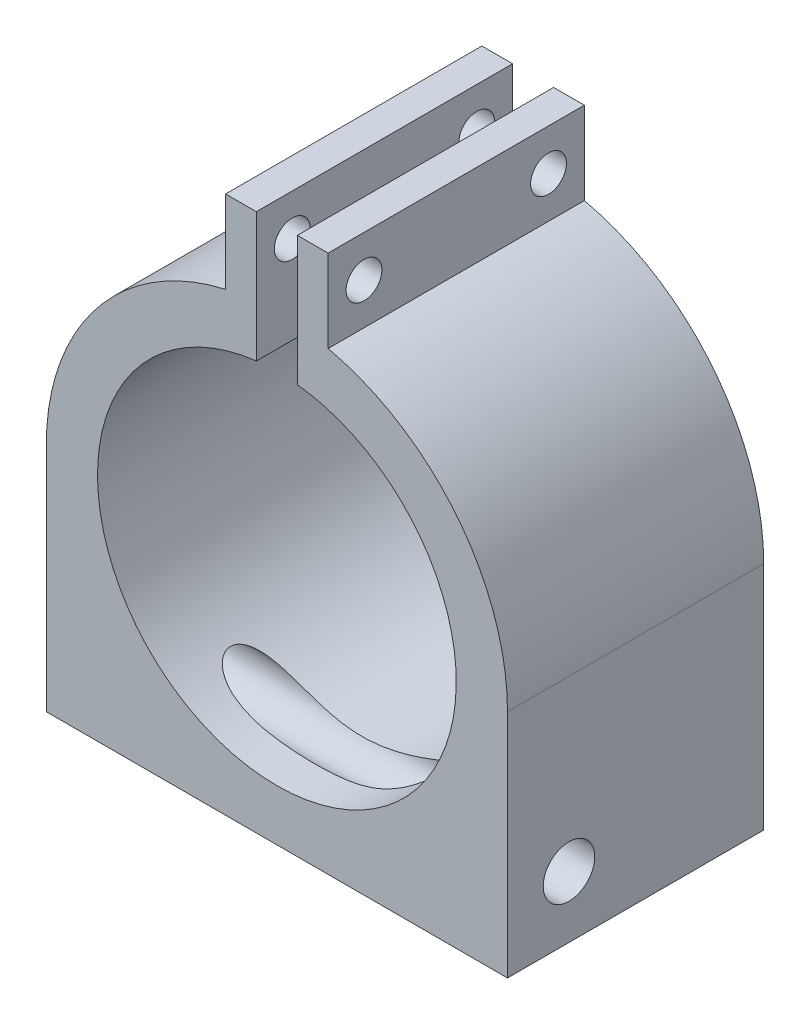
ISO-10303-21;
HEADER;
FILE_DESCRIPTION(('STEP AP214'),'2;1');
FILE_NAME('part.step','',(''),(''),'','','');
FILE_SCHEMA(('AUTOMOTIVE_DESIGN { 1 0 10303 214 1 1 1 1 }'));
ENDSEC;
DATA;
#1=APPLICATION_CONTEXT('core data for automotive mechanical design processes');
#2=APPLICATION_PROTOCOL_DEFINITION('international standard','automotive_design',2000,#1);
#3=PRODUCT_CONTEXT('',#1,'mechanical');
#4=PRODUCT('Part','Part','',(#3));
#5=PRODUCT_RELATED_PRODUCT_CATEGORY('part','',(#4));
#6=PRODUCT_DEFINITION_FORMATION('','',#4);
#7=PRODUCT_DEFINITION_CONTEXT('part definition',#1,'design');
#8=PRODUCT_DEFINITION('design','',#6,#7);
#9=PRODUCT_DEFINITION_SHAPE('','',#8);
#10=(LENGTH_UNIT() NAMED_UNIT(*) SI_UNIT(.MILLI.,.METRE.));
#11=(NAMED_UNIT(*) PLANE_ANGLE_UNIT() SI_UNIT($,.RADIAN.));
#12=(NAMED_UNIT(*) SI_UNIT($,.STERADIAN.) SOLID_ANGLE_UNIT());
#13=UNCERTAINTY_MEASURE_WITH_UNIT(LENGTH_MEASURE(1.E-05),#10,'distance_accuracy_value','');
#14=(GEOMETRIC_REPRESENTATION_CONTEXT(3) GLOBAL_UNCERTAINTY_ASSIGNED_CONTEXT((#13)) GLOBAL_UNIT_ASSIGNED_CONTEXT((#10,
#11,#12)) REPRESENTATION_CONTEXT('',''));
#15=CARTESIAN_POINT('',(0.,0.,0.));
#16=DIRECTION('',(0.,0.,1.));
#17=DIRECTION('',(1.,0.,0.));
#18=AXIS2_PLACEMENT_3D('',#15,#16,#17);
#19=CARTESIAN_POINT('',(-5.,30.,25.));
#20=DIRECTION('',(0.,1.,0.));
#21=DIRECTION('',(0.,0.,1.));
#22=AXIS2_PLACEMENT_3D('',#19,#20,#21);
#23=PLANE('',#22);
#24=DIRECTION('',(1.,0.,0.));
#25=VECTOR('',#24,1.);
#26=CARTESIAN_POINT('',(-5.,30.,0.));
#27=LINE('',#26,#25);
#28=CARTESIAN_POINT('',(2.,30.,0.));
#29=VERTEX_POINT('',#28);
#30=CARTESIAN_POINT('',(5.,30.,0.));
#31=VERTEX_POINT('',#30);
#32=EDGE_CURVE('E282',#29,#31,#27,.T.);
#33=ORIENTED_EDGE('',*,*,#32,.F.);
#34=DIRECTION('',(0.,0.,1.));
#35=VECTOR('',#34,1.);
#36=CARTESIAN_POINT('',(2.,30.,25.));
#37=LINE('',#36,#35);
#38=CARTESIAN_POINT('',(2.,30.,25.));
#39=VERTEX_POINT('',#38);
#40=EDGE_CURVE('E180',#29,#39,#37,.T.);
#41=ORIENTED_EDGE('',*,*,#40,.T.);
#42=DIRECTION('',(1.,0.,0.));
#43=VECTOR('',#42,1.);
#44=CARTESIAN_POINT('',(-5.,30.,25.));
#45=LINE('',#44,#43);
#46=CARTESIAN_POINT('',(5.,30.,25.));
#47=VERTEX_POINT('',#46);
#48=EDGE_CURVE('E346',#39,#47,#45,.T.);
#49=ORIENTED_EDGE('',*,*,#48,.T.);
#50=DIRECTION('',(0.,0.,-1.));
#51=VECTOR('',#50,1.);
#52=CARTESIAN_POINT('',(5.,30.,25.));
#53=LINE('',#52,#51);
#54=EDGE_CURVE('E196',#47,#31,#53,.T.);
#55=ORIENTED_EDGE('',*,*,#54,.T.);
#56=EDGE_LOOP('',(#33,#41,#49,#55));
#57=FACE_BOUND('',#56,.T.);
#58=ADVANCED_FACE('F89',(#57),#23,.T.);
#59=CARTESIAN_POINT('',(0.,0.,0.));
#60=DIRECTION('',(0.,0.,-1.));
#61=DIRECTION('',(-1.,0.,0.));
#62=AXIS2_PLACEMENT_3D('',#59,#60,#61);
#63=PLANE('',#62);
#64=CARTESIAN_POINT('',(0.,0.,0.));
#65=DIRECTION('',(0.,0.,1.));
#66=DIRECTION('',(1.,0.,0.));
#67=AXIS2_PLACEMENT_3D('',#64,#65,#66);
#68=CIRCLE('',#67,17.5);
#69=CARTESIAN_POINT('',(-2.,17.3853386507137,0.));
#70=VERTEX_POINT('',#69);
#71=CARTESIAN_POINT('',(2.,17.3853386507137,0.));
#72=VERTEX_POINT('',#71);
#73=EDGE_CURVE('E368',#70,#72,#68,.T.);
#74=ORIENTED_EDGE('',*,*,#73,.T.);
#75=DIRECTION('',(0.,-1.,0.));
#76=VECTOR('',#75,1.);
#77=CARTESIAN_POINT('',(2.,35.,0.));
#78=LINE('',#77,#76);
#79=EDGE_CURVE('E364',#29,#72,#78,.T.);
#80=ORIENTED_EDGE('',*,*,#79,.F.);
#81=ORIENTED_EDGE('',*,*,#32,.T.);
#82=DIRECTION('',(0.,-1.,0.));
#83=VECTOR('',#82,1.);
#84=CARTESIAN_POINT('',(5.,30.,0.));
#85=LINE('',#84,#83);
#86=CARTESIAN_POINT('',(5.,21.9374109684803,0.));
#87=VERTEX_POINT('',#86);
#88=EDGE_CURVE('E289',#31,#87,#85,.T.);
#89=ORIENTED_EDGE('',*,*,#88,.T.);
#90=CARTESIAN_POINT('',(0.,0.,0.));
#91=DIRECTION('',(0.,0.,1.));
#92=DIRECTION('',(1.,0.,0.));
#93=AXIS2_PLACEMENT_3D('',#90,#91,#92);
#94=CIRCLE('',#93,22.5);
#95=CARTESIAN_POINT('',(22.5,0.,0.));
#96=VERTEX_POINT('',#95);
#97=EDGE_CURVE('E306',#96,#87,#94,.T.);
#98=ORIENTED_EDGE('',*,*,#97,.F.);
#99=DIRECTION('',(0.,-1.,0.));
#100=VECTOR('',#99,1.);
#101=CARTESIAN_POINT('',(22.5,0.,0.));
#102=LINE('',#101,#100);
#103=CARTESIAN_POINT('',(22.5,-22.5,0.));
#104=VERTEX_POINT('',#103);
#105=EDGE_CURVE('E164',#96,#104,#102,.T.);
#106=ORIENTED_EDGE('',*,*,#105,.T.);
#107=DIRECTION('',(1.,0.,0.));
#108=VECTOR('',#107,1.);
#109=CARTESIAN_POINT('',(-22.5,-22.5,0.));
#110=LINE('',#109,#108);
#111=CARTESIAN_POINT('',(-22.5,-22.5,0.));
#112=VERTEX_POINT('',#111);
#113=EDGE_CURVE('E168',#112,#104,#110,.T.);
#114=ORIENTED_EDGE('',*,*,#113,.F.);
#115=DIRECTION('',(0.,-1.,0.));
#116=VECTOR('',#115,1.);
#117=CARTESIAN_POINT('',(-22.5,0.,0.));
#118=LINE('',#117,#116);
#119=CARTESIAN_POINT('',(-22.5,0.,0.));
#120=VERTEX_POINT('',#119);
#121=EDGE_CURVE('E151',#120,#112,#118,.T.);
#122=ORIENTED_EDGE('',*,*,#121,.F.);
#123=CARTESIAN_POINT('',(-5.,21.9374109684803,0.));
#124=VERTEX_POINT('',#123);
#125=EDGE_CURVE('E192',#124,#120,#94,.T.);
#126=ORIENTED_EDGE('',*,*,#125,.F.);
#127=DIRECTION('',(0.,-1.,0.));
#128=VECTOR('',#127,1.);
#129=CARTESIAN_POINT('',(-5.,30.,0.));
#130=LINE('',#129,#128);
#131=CARTESIAN_POINT('',(-5.,30.,0.));
#132=VERTEX_POINT('',#131);
#133=EDGE_CURVE('E280',#132,#124,#130,.T.);
#134=ORIENTED_EDGE('',*,*,#133,.F.);
#135=CARTESIAN_POINT('',(-2.,30.,0.));
#136=VERTEX_POINT('',#135);
#137=EDGE_CURVE('E269',#132,#136,#27,.T.);
#138=ORIENTED_EDGE('',*,*,#137,.T.);
#139=DIRECTION('',(0.,-1.,0.));
#140=VECTOR('',#139,1.);
#141=CARTESIAN_POINT('',(-2.,35.,0.));
#142=LINE('',#141,#140);
#143=EDGE_CURVE('E210',#136,#70,#142,.T.);
#144=ORIENTED_EDGE('',*,*,#143,.T.);
#145=EDGE_LOOP('',(#74,#80,#81,#89,#98,#106,#114,#122,#126,#134,#138,#144));
#146=FACE_BOUND('',#145,.T.);
#147=ADVANCED_FACE('F176',(#146),#63,.T.);
#148=CARTESIAN_POINT('',(0.,0.,25.));
#149=DIRECTION('',(0.,0.,-1.));
#150=DIRECTION('',(-1.,0.,0.));
#151=AXIS2_PLACEMENT_3D('',#148,#149,#150);
#152=PLANE('',#151);
#153=DIRECTION('',(0.,1.,0.));
#154=VECTOR('',#153,1.);
#155=CARTESIAN_POINT('',(2.,0.,25.));
#156=LINE('',#155,#154);
#157=CARTESIAN_POINT('',(2.,17.3853386507137,25.));
#158=VERTEX_POINT('',#157);
#159=EDGE_CURVE('E12',#158,#39,#156,.T.);
#160=ORIENTED_EDGE('',*,*,#159,.F.);
#161=CARTESIAN_POINT('',(0.,0.,25.));
#162=DIRECTION('',(0.,0.,1.));
#163=DIRECTION('',(1.,0.,0.));
#164=AXIS2_PLACEMENT_3D('',#161,#162,#163);
#165=CIRCLE('',#164,17.5);
#166=CARTESIAN_POINT('',(-2.,17.3853386507137,25.));
#167=VERTEX_POINT('',#166);
#168=EDGE_CURVE('E372',#167,#158,#165,.T.);
#169=ORIENTED_EDGE('',*,*,#168,.F.);
#170=DIRECTION('',(0.,1.,0.));
#171=VECTOR('',#170,1.);
#172=CARTESIAN_POINT('',(-2.,0.,25.));
#173=LINE('',#172,#171);
#174=CARTESIAN_POINT('',(-2.,30.,25.));
#175=VERTEX_POINT('',#174);
#176=EDGE_CURVE('E99',#167,#175,#173,.T.);
#177=ORIENTED_EDGE('',*,*,#176,.T.);
#178=CARTESIAN_POINT('',(-5.,30.,25.));
#179=VERTEX_POINT('',#178);
#180=EDGE_CURVE('E271',#179,#175,#45,.T.);
#181=ORIENTED_EDGE('',*,*,#180,.F.);
#182=DIRECTION('',(0.,-1.,0.));
#183=VECTOR('',#182,1.);
#184=CARTESIAN_POINT('',(-5.,30.,25.));
#185=LINE('',#184,#183);
#186=CARTESIAN_POINT('',(-5.,21.9374109684803,25.));
#187=VERTEX_POINT('',#186);
#188=EDGE_CURVE('E297',#179,#187,#185,.T.);
#189=ORIENTED_EDGE('',*,*,#188,.T.);
#190=CARTESIAN_POINT('',(0.,0.,25.));
#191=DIRECTION('',(0.,0.,1.));
#192=DIRECTION('',(1.,0.,0.));
#193=AXIS2_PLACEMENT_3D('',#190,#191,#192);
#194=CIRCLE('',#193,22.5);
#195=CARTESIAN_POINT('',(-22.5,0.,25.));
#196=VERTEX_POINT('',#195);
#197=EDGE_CURVE('E305',#187,#196,#194,.T.);
#198=ORIENTED_EDGE('',*,*,#197,.T.);
#199=DIRECTION('',(0.,-1.,0.));
#200=VECTOR('',#199,1.);
#201=CARTESIAN_POINT('',(-22.5,0.,25.));
#202=LINE('',#201,#200);
#203=CARTESIAN_POINT('',(-22.5,-22.5,25.));
#204=VERTEX_POINT('',#203);
#205=EDGE_CURVE('E172',#196,#204,#202,.T.);
#206=ORIENTED_EDGE('',*,*,#205,.T.);
#207=DIRECTION('',(1.,0.,0.));
#208=VECTOR('',#207,1.);
#209=CARTESIAN_POINT('',(-22.5,-22.5,25.));
#210=LINE('',#209,#208);
#211=CARTESIAN_POINT('',(22.5,-22.5,25.));
#212=VERTEX_POINT('',#211);
#213=EDGE_CURVE('E163',#204,#212,#210,.T.);
#214=ORIENTED_EDGE('',*,*,#213,.T.);
#215=DIRECTION('',(0.,-1.,0.));
#216=VECTOR('',#215,1.);
#217=CARTESIAN_POINT('',(22.5,0.,25.));
#218=LINE('',#217,#216);
#219=CARTESIAN_POINT('',(22.5,0.,25.));
#220=VERTEX_POINT('',#219);
#221=EDGE_CURVE('E316',#220,#212,#218,.T.);
#222=ORIENTED_EDGE('',*,*,#221,.F.);
#223=CARTESIAN_POINT('',(5.,21.9374109684803,25.));
#224=VERTEX_POINT('',#223);
#225=EDGE_CURVE('E301',#220,#224,#194,.T.);
#226=ORIENTED_EDGE('',*,*,#225,.T.);
#227=DIRECTION('',(0.,-1.,0.));
#228=VECTOR('',#227,1.);
#229=CARTESIAN_POINT('',(5.,30.,25.));
#230=LINE('',#229,#228);
#231=EDGE_CURVE('E286',#47,#224,#230,.T.);
#232=ORIENTED_EDGE('',*,*,#231,.F.);
#233=ORIENTED_EDGE('',*,*,#48,.F.);
#234=EDGE_LOOP('',(#160,#169,#177,#181,#189,#198,#206,#214,#222,#226,#232,#233));
#235=FACE_BOUND('',#234,.T.);
#236=ADVANCED_FACE('F246',(#235),#152,.F.);
#237=DIRECTION('',(0.,0.,1.));
#238=VECTOR('',#237,1.);
#239=CARTESIAN_POINT('',(-2.,30.,25.));
#240=LINE('',#239,#238);
#241=EDGE_CURVE('E107',#136,#175,#240,.T.);
#242=ORIENTED_EDGE('',*,*,#241,.F.);
#243=ORIENTED_EDGE('',*,*,#137,.F.);
#244=DIRECTION('',(0.,0.,-1.));
#245=VECTOR('',#244,1.);
#246=CARTESIAN_POINT('',(-5.,30.,25.));
#247=LINE('',#246,#245);
#248=EDGE_CURVE('E293',#179,#132,#247,.T.);
#249=ORIENTED_EDGE('',*,*,#248,.F.);
#250=ORIENTED_EDGE('',*,*,#180,.T.);
#251=EDGE_LOOP('',(#242,#243,#249,#250));
#252=FACE_BOUND('',#251,.T.);
#253=ADVANCED_FACE('F241',(#252),#23,.T.);
#254=CARTESIAN_POINT('',(-5.,30.,25.));
#255=DIRECTION('',(1.,0.,0.));
#256=DIRECTION('',(0.,1.,0.));
#257=AXIS2_PLACEMENT_3D('',#254,#255,#256);
#258=PLANE('',#257);
#259=CARTESIAN_POINT('',(-5.,25.9687054842402,21.5));
#260=DIRECTION('',(-1.,0.,0.));
#261=DIRECTION('',(0.,-1.,0.));
#262=AXIS2_PLACEMENT_3D('',#259,#260,#261);
#263=CIRCLE('',#262,1.75);
#264=CARTESIAN_POINT('',(-5.,24.2187054842402,21.5));
#265=VERTEX_POINT('',#264);
#266=EDGE_CURVE('E416',#265,#265,#263,.T.);
#267=ORIENTED_EDGE('',*,*,#266,.F.);
#268=EDGE_LOOP('',(#267));
#269=FACE_BOUND('',#268,.T.);
#270=CARTESIAN_POINT('',(-5.,25.9687054842402,3.5));
#271=DIRECTION('',(-1.,0.,0.));
#272=DIRECTION('',(0.,-1.,0.));
#273=AXIS2_PLACEMENT_3D('',#270,#271,#272);
#274=CIRCLE('',#273,1.75);
#275=CARTESIAN_POINT('',(-5.,24.2187054842402,3.5));
#276=VERTEX_POINT('',#275);
#277=EDGE_CURVE('E412',#276,#276,#274,.T.);
#278=ORIENTED_EDGE('',*,*,#277,.F.);
#279=EDGE_LOOP('',(#278));
#280=FACE_BOUND('',#279,.T.);
#281=DIRECTION('',(0.,0.,-1.));
#282=VECTOR('',#281,1.);
#283=CARTESIAN_POINT('',(-5.,21.9374109684803,25.));
#284=LINE('',#283,#282);
#285=EDGE_CURVE('E116',#187,#124,#284,.T.);
#286=ORIENTED_EDGE('',*,*,#285,.F.);
#287=ORIENTED_EDGE('',*,*,#188,.F.);
#288=ORIENTED_EDGE('',*,*,#248,.T.);
#289=ORIENTED_EDGE('',*,*,#133,.T.);
#290=EDGE_LOOP('',(#286,#287,#288,#289));
#291=FACE_BOUND('',#290,.T.);
#292=ADVANCED_FACE('F252',(#269,#280,#291),#258,.F.);
#293=CARTESIAN_POINT('',(5.,30.,25.));
#294=DIRECTION('',(1.,0.,0.));
#295=DIRECTION('',(0.,1.,0.));
#296=AXIS2_PLACEMENT_3D('',#293,#294,#295);
#297=PLANE('',#296);
#298=CARTESIAN_POINT('',(5.,25.9687054842402,21.5));
#299=DIRECTION('',(1.,0.,0.));
#300=DIRECTION('',(0.,1.,0.));
#301=AXIS2_PLACEMENT_3D('',#298,#299,#300);
#302=CIRCLE('',#301,1.75);
#303=CARTESIAN_POINT('',(5.,27.7187054842402,21.5));
#304=VERTEX_POINT('',#303);
#305=EDGE_CURVE('E394',#304,#304,#302,.T.);
#306=ORIENTED_EDGE('',*,*,#305,.F.);
#307=EDGE_LOOP('',(#306));
#308=FACE_BOUND('',#307,.T.);
#309=CARTESIAN_POINT('',(5.,25.9687054842402,3.5));
#310=DIRECTION('',(1.,0.,0.));
#311=DIRECTION('',(0.,1.,0.));
#312=AXIS2_PLACEMENT_3D('',#309,#310,#311);
#313=CIRCLE('',#312,1.75);
#314=CARTESIAN_POINT('',(5.,27.7187054842402,3.5));
#315=VERTEX_POINT('',#314);
#316=EDGE_CURVE('E404',#315,#315,#313,.T.);
#317=ORIENTED_EDGE('',*,*,#316,.F.);
#318=EDGE_LOOP('',(#317));
#319=FACE_BOUND('',#318,.T.);
#320=ORIENTED_EDGE('',*,*,#231,.T.);
#321=DIRECTION('',(0.,0.,-1.));
#322=VECTOR('',#321,1.);
#323=CARTESIAN_POINT('',(5.,21.9374109684803,25.));
#324=LINE('',#323,#322);
#325=EDGE_CURVE('E195',#224,#87,#324,.T.);
#326=ORIENTED_EDGE('',*,*,#325,.T.);
#327=ORIENTED_EDGE('',*,*,#88,.F.);
#328=ORIENTED_EDGE('',*,*,#54,.F.);
#329=EDGE_LOOP('',(#320,#326,#327,#328));
#330=FACE_BOUND('',#329,.T.);
#331=ADVANCED_FACE('F259',(#308,#319,#330),#297,.T.);
#332=CARTESIAN_POINT('',(-22.5,-22.5,25.));
#333=DIRECTION('',(0.,1.,0.));
#334=DIRECTION('',(0.,0.,1.));
#335=AXIS2_PLACEMENT_3D('',#332,#333,#334);
#336=PLANE('',#335);
#337=ORIENTED_EDGE('',*,*,#113,.T.);
#338=DIRECTION('',(0.,0.,-1.));
#339=VECTOR('',#338,1.);
#340=CARTESIAN_POINT('',(22.5,-22.5,25.));
#341=LINE('',#340,#339);
#342=EDGE_CURVE('E171',#212,#104,#341,.T.);
#343=ORIENTED_EDGE('',*,*,#342,.F.);
#344=ORIENTED_EDGE('',*,*,#213,.F.);
#345=DIRECTION('',(0.,0.,-1.));
#346=VECTOR('',#345,1.);
#347=CARTESIAN_POINT('',(-22.5,-22.5,25.));
#348=LINE('',#347,#346);
#349=EDGE_CURVE('E155',#204,#112,#348,.T.);
#350=ORIENTED_EDGE('',*,*,#349,.T.);
#351=EDGE_LOOP('',(#337,#343,#344,#350));
#352=FACE_BOUND('',#351,.T.);
#353=ADVANCED_FACE('F91',(#352),#336,.F.);
#354=CARTESIAN_POINT('',(22.5,0.,25.));
#355=DIRECTION('',(1.,0.,0.));
#356=DIRECTION('',(0.,0.,-1.));
#357=AXIS2_PLACEMENT_3D('',#354,#355,#356);
#358=PLANE('',#357);
#359=CARTESIAN_POINT('',(22.5,-16.5,19.));
#360=DIRECTION('',(-1.,0.,0.));
#361=DIRECTION('',(0.,0.,1.));
#362=AXIS2_PLACEMENT_3D('',#359,#360,#361);
#363=CIRCLE('',#362,2.51386335466572);
#364=CARTESIAN_POINT('',(22.5,-16.5,21.5138633546657));
#365=VERTEX_POINT('',#364);
#366=EDGE_CURVE('E211',#365,#365,#363,.T.);
#367=ORIENTED_EDGE('',*,*,#366,.T.);
#368=EDGE_LOOP('',(#367));
#369=FACE_BOUND('',#368,.T.);
#370=ORIENTED_EDGE('',*,*,#105,.F.);
#371=DIRECTION('',(0.,0.,-1.));
#372=VECTOR('',#371,1.);
#373=CARTESIAN_POINT('',(22.5,0.,25.));
#374=LINE('',#373,#372);
#375=EDGE_CURVE('E312',#220,#96,#374,.T.);
#376=ORIENTED_EDGE('',*,*,#375,.F.);
#377=ORIENTED_EDGE('',*,*,#221,.T.);
#378=ORIENTED_EDGE('',*,*,#342,.T.);
#379=EDGE_LOOP('',(#370,#376,#377,#378));
#380=FACE_BOUND('',#379,.T.);
#381=ADVANCED_FACE('F478',(#369,#380),#358,.T.);
#382=CARTESIAN_POINT('',(-22.5,0.,25.));
#383=DIRECTION('',(1.,0.,0.));
#384=DIRECTION('',(0.,1.,0.));
#385=AXIS2_PLACEMENT_3D('',#382,#383,#384);
#386=PLANE('',#385);
#387=CARTESIAN_POINT('',(-22.5,-16.5,19.));
#388=DIRECTION('',(-1.,0.,0.));
#389=DIRECTION('',(0.,0.,1.));
#390=AXIS2_PLACEMENT_3D('',#387,#388,#389);
#391=CIRCLE('',#390,2.51386335466572);
#392=CARTESIAN_POINT('',(-22.5,-16.5,21.5138633546657));
#393=VERTEX_POINT('',#392);
#394=EDGE_CURVE('E390',#393,#393,#391,.T.);
#395=ORIENTED_EDGE('',*,*,#394,.F.);
#396=EDGE_LOOP('',(#395));
#397=FACE_BOUND('',#396,.T.);
#398=ORIENTED_EDGE('',*,*,#121,.T.);
#399=ORIENTED_EDGE('',*,*,#349,.F.);
#400=ORIENTED_EDGE('',*,*,#205,.F.);
#401=DIRECTION('',(0.,0.,-1.));
#402=VECTOR('',#401,1.);
#403=CARTESIAN_POINT('',(-22.5,0.,25.));
#404=LINE('',#403,#402);
#405=EDGE_CURVE('E158',#196,#120,#404,.T.);
#406=ORIENTED_EDGE('',*,*,#405,.T.);
#407=EDGE_LOOP('',(#398,#399,#400,#406));
#408=FACE_BOUND('',#407,.T.);
#409=ADVANCED_FACE('F153',(#397,#408),#386,.F.);
#410=CARTESIAN_POINT('',(0.,0.,25.));
#411=DIRECTION('',(0.,0.,-1.));
#412=DIRECTION('',(-1.,0.,0.));
#413=AXIS2_PLACEMENT_3D('',#410,#411,#412);
#414=CYLINDRICAL_SURFACE('',#413,22.5);
#415=ORIENTED_EDGE('',*,*,#325,.F.);
#416=ORIENTED_EDGE('',*,*,#225,.F.);
#417=ORIENTED_EDGE('',*,*,#375,.T.);
#418=ORIENTED_EDGE('',*,*,#97,.T.);
#419=EDGE_LOOP('',(#415,#416,#417,#418));
#420=FACE_BOUND('',#419,.T.);
#421=ADVANCED_FACE('F500',(#420),#414,.T.);
#422=ORIENTED_EDGE('',*,*,#197,.F.);
#423=ORIENTED_EDGE('',*,*,#285,.T.);
#424=ORIENTED_EDGE('',*,*,#125,.T.);
#425=ORIENTED_EDGE('',*,*,#405,.F.);
#426=EDGE_LOOP('',(#422,#423,#424,#425));
#427=FACE_BOUND('',#426,.T.);
#428=ADVANCED_FACE('F326',(#427),#414,.T.);
#429=CARTESIAN_POINT('',(0.,0.,0.));
#430=DIRECTION('',(0.,0.,1.));
#431=DIRECTION('',(1.,0.,0.));
#432=AXIS2_PLACEMENT_3D('',#429,#430,#431);
#433=CYLINDRICAL_SURFACE('',#432,17.5);
#434=CARTESIAN_POINT('',(5.83095189484532,-16.5,21.5138633546657));
#435=CARTESIAN_POINT('',(5.63074685282877,-16.5707507486325,21.5138629543976));
#436=CARTESIAN_POINT('',(5.42926112967133,-16.6378538312997,21.5108867368972));
#437=CARTESIAN_POINT('',(5.02406033750187,-16.7646620964868,21.5007015135017));
#438=CARTESIAN_POINT('',(4.82034495008288,-16.824366206991,21.4934918951078));
#439=CARTESIAN_POINT('',(4.41083616357391,-16.9363401729758,21.4763533407027));
#440=CARTESIAN_POINT('',(4.20504131996773,-16.9886044166456,21.4664223683459));
#441=CARTESIAN_POINT('',(3.79175196567162,-17.085598393498,21.4452091514938));
#442=CARTESIAN_POINT('',(3.58425742631316,-17.1303279993195,21.4339268841625));
#443=CARTESIAN_POINT('',(3.16737345719175,-17.2122910124585,21.4112160509242));
#444=CARTESIAN_POINT('',(2.95798109051066,-17.2495094126902,21.3997872397194));
#445=CARTESIAN_POINT('',(2.53795003763319,-17.3162936451787,21.3779001347235));
#446=CARTESIAN_POINT('',(2.32731148426367,-17.3458602784992,21.3674417394132));
#447=CARTESIAN_POINT('',(1.90508704555478,-17.3972944817184,21.3484301167168));
#448=CARTESIAN_POINT('',(1.69350153703331,-17.4191648785996,21.3398761902061));
#449=CARTESIAN_POINT('',(1.2695831498345,-17.4551828448844,21.3254058458313));
#450=CARTESIAN_POINT('',(1.05725027652525,-17.469330469645,21.3194894090618));
#451=CARTESIAN_POINT('',(0.632226038752403,-17.489869603977,21.3107990198308));
#452=CARTESIAN_POINT('',(0.419534844778839,-17.4962641123509,21.3080238523957));
#453=CARTESIAN_POINT('',(-0.00595662314590569,-17.501292274554,21.3058470112317));
#454=CARTESIAN_POINT('',(-0.218756896889117,-17.4999259431251,21.3064453310949));
#455=CARTESIAN_POINT('',(-0.644173594583405,-17.4894345964588,21.3109652535423));
#456=CARTESIAN_POINT('',(-0.856789971646115,-17.4803079834214,21.3148875405128));
#457=CARTESIAN_POINT('',(-1.28147254198689,-17.454314290518,21.325723682341));
#458=CARTESIAN_POINT('',(-1.49353872952872,-17.437447130273,21.3326375682639));
#459=CARTESIAN_POINT('',(-1.91688819899417,-17.395999270713,21.3488696845204));
#460=CARTESIAN_POINT('',(-2.12817121420144,-17.3714161512191,21.3581886690712));
#461=CARTESIAN_POINT('',(-2.54961931102472,-17.3145792331154,21.3784193396405));
#462=CARTESIAN_POINT('',(-2.75978441553964,-17.2823255922495,21.3893309929041));
#463=CARTESIAN_POINT('',(-3.17871639177022,-17.2101983537365,21.4117530653725));
#464=CARTESIAN_POINT('',(-3.38748359898364,-17.1703266576322,21.4232633346361));
#465=CARTESIAN_POINT('',(-3.80345593997204,-17.083000020913,21.4457415021733));
#466=CARTESIAN_POINT('',(-4.01066105689456,-17.0355449986082,21.4567093946027));
#467=CARTESIAN_POINT('',(-4.46836807159724,-16.9219021933311,21.4790238716231));
#468=CARTESIAN_POINT('',(-4.71844120663029,-16.8538867706154,21.4899298796388));
#469=CARTESIAN_POINT('',(-5.21545766851665,-16.7067695570382,21.5064388363992));
#470=CARTESIAN_POINT('',(-5.46240148638751,-16.6276695295367,21.5120426275337));
#471=CARTESIAN_POINT('',(-5.95230651184907,-16.4586485099609,21.5149430558086));
#472=CARTESIAN_POINT('',(-6.1952721186095,-16.368740537859,21.5122495938884));
#473=CARTESIAN_POINT('',(-6.67660063793639,-16.1783774880652,21.4950384716585));
#474=CARTESIAN_POINT('',(-6.9149652419262,-16.0779263771728,21.4805252446784));
#475=CARTESIAN_POINT('',(-7.29500476634655,-15.9077985120945,21.4440081350659));
#476=CARTESIAN_POINT('',(-7.43853790418182,-15.8411821449302,21.4270470480257));
#477=CARTESIAN_POINT('',(-7.72287290525447,-15.7045247305628,21.3857553963694));
#478=CARTESIAN_POINT('',(-7.86367540527722,-15.6344844955524,21.3614265724453));
#479=CARTESIAN_POINT('',(-8.14183927451075,-15.4914452093832,21.3039669157184));
#480=CARTESIAN_POINT('',(-8.27920330622863,-15.418448569832,21.2708431393126));
#481=CARTESIAN_POINT('',(-8.54961392735455,-15.2701634955729,21.1940781008222));
#482=CARTESIAN_POINT('',(-8.68266259384695,-15.1948761982744,21.1504419864343));
#483=CARTESIAN_POINT('',(-8.97051299049238,-15.0270748703708,21.0401249387603));
#484=CARTESIAN_POINT('',(-9.12406941839064,-14.9342406683193,20.970536568252));
#485=CARTESIAN_POINT('',(-9.34553720056051,-14.7958970617814,20.8491298396746));
#486=CARTESIAN_POINT('',(-9.41786961226441,-14.7499420998064,20.8058330069447));
#487=CARTESIAN_POINT('',(-9.55893424873534,-14.6589156683931,20.712935716993));
#488=CARTESIAN_POINT('',(-9.62766771242996,-14.6138438983067,20.663337449438));
#489=CARTESIAN_POINT('',(-9.78837814685701,-14.5069088174407,20.5351478688003));
#490=CARTESIAN_POINT('',(-9.8781639198143,-14.4458392786821,20.4530663710846));
#491=CARTESIAN_POINT('',(-10.0455554729022,-14.3299388278688,20.2734672127892));
#492=CARTESIAN_POINT('',(-10.1231812905007,-14.2750976944027,20.17597548981));
#493=CARTESIAN_POINT('',(-10.2443765712368,-14.1882650379416,19.9914694753969));
#494=CARTESIAN_POINT('',(-10.2916049583358,-14.1539920849138,19.9079573416481));
#495=CARTESIAN_POINT('',(-10.374349594304,-14.0934559843809,19.7325566128521));
#496=CARTESIAN_POINT('',(-10.4098728977089,-14.0671880130743,19.6406731059329));
#497=CARTESIAN_POINT('',(-10.4670814896236,-14.0246751524442,19.4493861538047));
#498=CARTESIAN_POINT('',(-10.4886324607375,-14.0085275995279,19.3499197008717));
#499=CARTESIAN_POINT('',(-10.5154312987956,-13.9884241191911,19.1476180552758));
#500=CARTESIAN_POINT('',(-10.5206942992259,-13.9844568748246,19.0447860794364));
#501=CARTESIAN_POINT('',(-10.5149174525462,-13.9887990396926,18.854775479604));
#502=CARTESIAN_POINT('',(-10.5061180719783,-13.9954213771436,18.7674769778129));
#503=CARTESIAN_POINT('',(-10.4768973162469,-14.0173090369675,18.595987130146));
#504=CARTESIAN_POINT('',(-10.4564745849483,-14.0325753678629,18.5117961480555));
#505=CARTESIAN_POINT('',(-10.405165994864,-14.0706620294198,18.3481371482154));
#506=CARTESIAN_POINT('',(-10.374237572194,-14.0935130808909,18.2686899142696));
#507=CARTESIAN_POINT('',(-10.3035130980914,-14.1453011155936,18.1160250900372));
#508=CARTESIAN_POINT('',(-10.2637134717267,-14.1742405520676,18.0428100276844));
#509=CARTESIAN_POINT('',(-10.1516920275445,-14.2548312720388,17.8627687451454));
#510=CARTESIAN_POINT('',(-10.0740057043347,-14.3099583291103,17.7608965915276));
#511=CARTESIAN_POINT('',(-9.90538758796396,-14.4271926056225,17.5733663538501));
#512=CARTESIAN_POINT('',(-9.81442040599491,-14.4893183698502,17.4877530419127));
#513=CARTESIAN_POINT('',(-9.64281802401164,-14.6039182916426,17.3474909321043));
#514=CARTESIAN_POINT('',(-9.56393541669873,-14.6557321496728,17.2900998567406));
#515=CARTESIAN_POINT('',(-9.40142313089445,-14.7605078405231,17.1836131355037));
#516=CARTESIAN_POINT('',(-9.31779055958931,-14.8134703604966,17.1345226187844));
#517=CARTESIAN_POINT('',(-9.14669775368254,-14.9197210482856,17.0436980183836));
#518=CARTESIAN_POINT('',(-9.05923318496988,-14.973009522952,17.001972547703));
#519=CARTESIAN_POINT('',(-8.88125682489638,-15.0792585814799,16.9250785781089));
#520=CARTESIAN_POINT('',(-8.79074389070561,-15.1322190333551,16.8899125713775));
#521=CARTESIAN_POINT('',(-8.5291137099045,-15.2820959249026,16.7978884682851));
#522=CARTESIAN_POINT('',(-8.3549673716118,-15.3780550762354,16.748045776144));
#523=CARTESIAN_POINT('',(-8.00051592259,-15.5654121892706,16.6640670250232));
#524=CARTESIAN_POINT('',(-7.82020554674425,-15.6568060787708,16.6299447731984));
#525=CARTESIAN_POINT('',(-7.45455378367635,-15.8341724330757,16.5741309120638));
#526=CARTESIAN_POINT('',(-7.26920130443438,-15.9201312809342,16.5524695028064));
#527=CARTESIAN_POINT('',(-6.89493609393121,-16.0857621100073,16.5190634010496));
#528=CARTESIAN_POINT('',(-6.70602431990672,-16.1654357524906,16.5073160801012));
#529=CARTESIAN_POINT('',(-6.3186057930655,-16.3208546182089,16.491269586493));
#530=CARTESIAN_POINT('',(-6.11999441731543,-16.3963653127828,16.487244996635));
#531=CARTESIAN_POINT('',(-5.72010544561121,-16.5401195518927,16.4854295025871));
#532=CARTESIAN_POINT('',(-5.5188273095131,-16.608361598081,16.4876398810927));
#533=CARTESIAN_POINT('',(-5.11385691303356,-16.7374931106738,16.4965430982691));
#534=CARTESIAN_POINT('',(-4.91016283649824,-16.7983766025406,16.503239550783));
#535=CARTESIAN_POINT('',(-4.50078532959635,-16.9126609759161,16.5195663173968));
#536=CARTESIAN_POINT('',(-4.29510167963612,-16.9660610211495,16.5291969590111));
#537=CARTESIAN_POINT('',(-3.88200705217008,-17.0653199791597,16.55000136891));
#538=CARTESIAN_POINT('',(-3.67459610362831,-17.1111790181207,16.5611751113679));
#539=CARTESIAN_POINT('',(-3.25825780294825,-17.1953150713382,16.5838162317598));
#540=CARTESIAN_POINT('',(-3.04933044528091,-17.2335920579351,16.5952836107649));
#541=CARTESIAN_POINT('',(-2.63025725813699,-17.3025091048579,16.6173967758287));
#542=CARTESIAN_POINT('',(-2.42011192500369,-17.3331520791096,16.6280428742981));
#543=CARTESIAN_POINT('',(-1.99877779402253,-17.3867761127995,16.6475647965937));
#544=CARTESIAN_POINT('',(-1.78758907019985,-17.4097577080857,16.6564407442094));
#545=CARTESIAN_POINT('',(-1.34427807125307,-17.4498437877305,16.6723792434819));
#546=CARTESIAN_POINT('',(-1.11207656210431,-17.4661806857913,16.6791887843559));
#547=CARTESIAN_POINT('',(-0.647123436351635,-17.4895801465156,16.6890690560347));
#548=CARTESIAN_POINT('',(-0.414371814203234,-17.496642615301,16.692139748994));
#549=CARTESIAN_POINT('',(0.0512893624852162,-17.5014740645258,16.694232004421));
#550=CARTESIAN_POINT('',(0.284198938038213,-17.4992413559909,16.6932528310106));
#551=CARTESIAN_POINT('',(0.749690224295754,-17.4854849284893,16.6873427223076));
#552=CARTESIAN_POINT('',(0.982271936693997,-17.4739612576959,16.6824118075046));
#553=CARTESIAN_POINT('',(1.44690020930216,-17.4416387333221,16.6690924641933));
#554=CARTESIAN_POINT('',(1.67894608949309,-17.4208314447206,16.6607008918853));
#555=CARTESIAN_POINT('',(2.14191793137981,-17.369986282579,16.6413199966392));
#556=CARTESIAN_POINT('',(2.37284386047627,-17.3399481419677,16.6303305985416));
#557=CARTESIAN_POINT('',(2.83319442581126,-17.2707028973238,16.6069139916383));
#558=CARTESIAN_POINT('',(3.06261935221407,-17.2314976227001,16.5944870699569));
#559=CARTESIAN_POINT('',(3.51970124234724,-17.1439740917414,16.5695938418937));
#560=CARTESIAN_POINT('',(3.74735833378188,-17.0956565001566,16.5571275384501));
#561=CARTESIAN_POINT('',(4.24908956648128,-16.9786636413351,16.5312527178911));
#562=CARTESIAN_POINT('',(4.52268671053036,-16.9078444901503,16.5182121352124));
#563=CARTESIAN_POINT('',(5.06634407356114,-16.7529708389783,16.4976772149554));
#564=CARTESIAN_POINT('',(5.33640428404602,-16.668916307202,16.4901828906986));
#565=CARTESIAN_POINT('',(5.87151760663406,-16.488020937764,16.4845403401133));
#566=CARTESIAN_POINT('',(6.13658240098985,-16.391215729233,16.4863665873065));
#567=CARTESIAN_POINT('',(6.66130941320823,-16.1850634510823,16.5037934441286));
#568=CARTESIAN_POINT('',(6.92097437402227,-16.07572294244,16.5193868763928));
#569=CARTESIAN_POINT('',(7.30860200463121,-15.9014207750249,16.557694227218));
#570=CARTESIAN_POINT('',(7.43920923343725,-15.8407326473648,16.5732587763046));
#571=CARTESIAN_POINT('',(7.69817638067056,-15.7165098934097,16.6104681028189));
#572=CARTESIAN_POINT('',(7.82653673199656,-15.6529758240186,16.632111695009));
#573=CARTESIAN_POINT('',(8.080644445725,-15.5233226572195,16.6825762944389));
#574=CARTESIAN_POINT('',(8.20638995839479,-15.4572018192325,16.7114022070406));
#575=CARTESIAN_POINT('',(8.4545173857023,-15.3228918531767,16.7774946286993));
#576=CARTESIAN_POINT('',(8.57690015627505,-15.2547032608954,16.8147589671427));
#577=CARTESIAN_POINT('',(8.78692270863607,-15.13442113299,16.8885228518091));
#578=CARTESIAN_POINT('',(8.87550631332174,-15.0826287305401,16.9228222913819));
#579=CARTESIAN_POINT('',(9.04977680175087,-14.9787123115594,16.9976778137724));
#580=CARTESIAN_POINT('',(9.13546450561051,-14.926588393967,17.0382321068108));
#581=CARTESIAN_POINT('',(9.30315612386539,-14.8226514169802,17.1263286655764));
#582=CARTESIAN_POINT('',(9.38516618971713,-14.7708379744611,17.1738586471518));
#583=CARTESIAN_POINT('',(9.54472054484522,-14.6682412947311,17.2767921990125));
#584=CARTESIAN_POINT('',(9.62226746235951,-14.6174574628615,17.3321910674416));
#585=CARTESIAN_POINT('',(9.78718050143617,-14.5076804782895,17.464101713209));
#586=CARTESIAN_POINT('',(9.87328472291465,-14.4491477499617,17.5426123132752));
#587=CARTESIAN_POINT('',(10.0344499220979,-14.3376912801594,17.7137932254525));
#588=CARTESIAN_POINT('',(10.1095231627939,-14.2847613287469,17.8064475768106));
#589=CARTESIAN_POINT('',(10.2309320323901,-14.1979729764514,17.9860968417074));
#590=CARTESIAN_POINT('',(10.2800065989607,-14.1624257544292,18.0704026591052));
#591=CARTESIAN_POINT('',(10.3661669152267,-14.0994835798833,18.247773093964));
#592=CARTESIAN_POINT('',(10.4032676437244,-14.072078445365,18.3408265786881));
#593=CARTESIAN_POINT('',(10.4584652026196,-14.0310909525676,18.5193014456701));
#594=CARTESIAN_POINT('',(10.478584592827,-14.0160469983196,18.6037564332622));
#595=CARTESIAN_POINT('',(10.5071213543134,-13.9946678440133,18.7757038857066));
#596=CARTESIAN_POINT('',(10.5155447271323,-13.9883281775705,18.8631947691178));
#597=CARTESIAN_POINT('',(10.5201038515183,-13.984899896467,19.0388262111036));
#598=CARTESIAN_POINT('',(10.5162194512833,-13.9878264536034,19.1269675991654));
#599=CARTESIAN_POINT('',(10.4964019676168,-14.0027030358876,19.3010990685216));
#600=CARTESIAN_POINT('',(10.4804654944939,-14.0146555996327,19.3870885375503));
#601=CARTESIAN_POINT('',(10.4379506230705,-14.0463470156254,19.5533062082119));
#602=CARTESIAN_POINT('',(10.4115479728692,-14.0659572036829,19.6336049525663));
#603=CARTESIAN_POINT('',(10.3495342594026,-14.1116485240044,19.7885586654188));
#604=CARTESIAN_POINT('',(10.3139194889463,-14.1377322612174,19.8632113461303));
#605=CARTESIAN_POINT('',(10.2150385603932,-14.2094449616533,20.0422497247865));
#606=CARTESIAN_POINT('',(10.1468851780035,-14.2582971072203,20.1426449103177));
#607=CARTESIAN_POINT('',(9.9975726984921,-14.3633872758118,20.3288705166614));
#608=CARTESIAN_POINT('',(9.91638258343636,-14.4196428545468,20.4146651701819));
#609=CARTESIAN_POINT('',(9.76402669939956,-14.5230941610475,20.5547042921967));
#610=CARTESIAN_POINT('',(9.6947603739956,-14.5694530081698,20.6116921257505));
#611=CARTESIAN_POINT('',(9.55165748885444,-14.6636686083417,20.71827230522));
#612=CARTESIAN_POINT('',(9.47781833196874,-14.7115262048394,20.767860392906));
#613=CARTESIAN_POINT('',(9.32639467499603,-14.8079855325654,20.8603950181902));
#614=CARTESIAN_POINT('',(9.24880479636116,-14.8565882598038,20.9033316231097));
#615=CARTESIAN_POINT('',(9.09063324788466,-14.9538966781006,20.9831873244341));
#616=CARTESIAN_POINT('',(9.01005046669557,-15.0026024009434,21.0201041575407));
#617=CARTESIAN_POINT('',(8.78062400314377,-15.1386930451786,21.1160958327689));
#618=CARTESIAN_POINT('',(8.62900088102019,-15.2256839155077,21.1691146042854));
#619=CARTESIAN_POINT('',(8.31990009091394,-15.3967711786313,21.2609323557438));
#620=CARTESIAN_POINT('',(8.1624174582962,-15.4808649950438,21.2997189603179));
#621=CARTESIAN_POINT('',(7.84289766226067,-15.6451673239649,21.3657157453438));
#622=CARTESIAN_POINT('',(7.68085604010989,-15.7253718080487,21.3929141409216));
#623=CARTESIAN_POINT('',(7.3533848710138,-15.881140182631,21.4378442919479));
#624=CARTESIAN_POINT('',(7.18795656184317,-15.956705729584,21.4555794441012));
#625=CARTESIAN_POINT('',(6.82599683033307,-16.1152456140073,21.4857687333144));
#626=CARTESIAN_POINT('',(6.62894913305816,-16.1973026065431,21.496816889772));
#627=CARTESIAN_POINT('',(6.23201339530602,-16.3541281281181,21.5108593679271));
#628=CARTESIAN_POINT('',(6.0321292202975,-16.4289056547215,21.5138637568777));
#629=CARTESIAN_POINT('',(5.83095189484532,-16.5,21.5138633546657));
#630=B_SPLINE_CURVE_WITH_KNOTS('',3,(#434,#435,#436,#437,#438,#439,#440,#441,#442,#443,#444,
#445,#446,#447,#448,#449,#450,#451,#452,#453,#454,#455,#456,#457,#458,#459,#460,#461,#462,#463,
#464,#465,#466,#467,#468,#469,#470,#471,#472,#473,#474,#475,#476,#477,#478,#479,#480,#481,#482,
#483,#484,#485,#486,#487,#488,#489,#490,#491,#492,#493,#494,#495,#496,#497,#498,#499,#500,#501,
#502,#503,#504,#505,#506,#507,#508,#509,#510,#511,#512,#513,#514,#515,#516,#517,#518,#519,#520,
#521,#522,#523,#524,#525,#526,#527,#528,#529,#530,#531,#532,#533,#534,#535,#536,#537,#538,#539,
#540,#541,#542,#543,#544,#545,#546,#547,#548,#549,#550,#551,#552,#553,#554,#555,#556,#557,#558,
#559,#560,#561,#562,#563,#564,#565,#566,#567,#568,#569,#570,#571,#572,#573,#574,#575,#576,#577,
#578,#579,#580,#581,#582,#583,#584,#585,#586,#587,#588,#589,#590,#591,#592,#593,#594,#595,#596,
#597,#598,#599,#600,#601,#602,#603,#604,#605,#606,#607,#608,#609,#610,#611,#612,#613,#614,#615,
#616,#617,#618,#619,#620,#621,#622,#623,#624,#625,#626,#627,#628,#629),.UNSPECIFIED.,.T.,.F.,(4,
2,2,2,2,2,2,2,2,2,2,2,2,2,2,2,2,2,2,2,2,2,2,2,2,2,2,2,2,2,2,2,2,2,2,2,2,2,2,2,2,2,2,2,2,2,2,2,2,
2,2,2,2,2,2,2,2,2,2,2,2,2,2,2,2,2,2,2,2,2,2,2,2,2,2,2,2,2,2,2,2,2,2,2,2,2,2,2,2,2,2,2,2,2,2,2,2,
4),(0.,0.636960060993273,1.2740123016528,1.91154254620188,2.54908356611004,3.18788602446542,
3.82662157950181,4.46512226862898,5.1036183809278,5.74186745253837,6.38011531177223,
7.01849461461062,7.65688054661776,8.29546691446632,8.93404015096537,9.57245420094463,
10.2108751285698,10.9887460350372,11.7664933365003,12.5433129279425,13.3198412858359,
13.79708723971,14.2742205279225,14.7509721516355,15.2274907917733,15.8033196297968,
16.0911291848121,16.3788390018814,16.7859452644894,17.1923734660613,17.4968948035219,
17.8012322719212,18.1084536121149,18.4153894208625,18.6780851632344,18.9408115614792,
19.2046153514835,19.4685256423823,19.8845683112695,20.301740536023,20.6326580210557,
20.9637792480968,21.2952851733582,21.6269167945321,22.2408374367408,22.8552962581023,
23.4712380726697,24.0870165357913,24.7243105463233,25.3617356744195,25.999674911041,
26.6376853806358,27.2756851732708,27.9136872933126,28.5514455115753,29.1891591147334,
29.8875707506955,30.5859894561044,31.2845350727781,31.9830770675318,32.6822550485649,
33.3814532604493,34.0805120580716,34.7795198785602,35.6279021985848,36.476286556313,
37.3223486718281,38.1679699628146,38.6024027212495,39.0367508365916,39.4713964189265,
39.9059303242635,40.2303268748319,40.5546307733888,40.8783702786612,41.2019171489599,
41.5920250406451,41.9816959191889,42.2920229959173,42.6019603472113,42.8651406464711,
43.1281858509006,43.391661967763,43.6552122158552,43.9145126376773,44.1739175713572,
44.5641365184845,44.9552980481136,45.2577924858017,45.5604603300184,45.8635758803966,
46.1668051339096,46.7138916458662,47.2614527476873,47.8095693818233,48.3574891442376,
48.9983450074317,49.6383984256662),.UNSPECIFIED.);
#631=CARTESIAN_POINT('',(5.83095189484532,-16.5,21.5138633546657));
#632=VERTEX_POINT('',#631);
#633=EDGE_CURVE('E202',#632,#632,#630,.T.);
#634=ORIENTED_EDGE('',*,*,#633,.T.);
#635=EDGE_LOOP('',(#634));
#636=FACE_BOUND('',#635,.T.);
#637=DIRECTION('',(0.,0.,1.));
#638=VECTOR('',#637,1.);
#639=CARTESIAN_POINT('',(-2.,17.3853386507137,0.));
#640=LINE('',#639,#638);
#641=EDGE_CURVE('E276',#70,#167,#640,.T.);
#642=ORIENTED_EDGE('',*,*,#641,.T.);
#643=ORIENTED_EDGE('',*,*,#168,.T.);
#644=DIRECTION('',(0.,0.,1.));
#645=VECTOR('',#644,1.);
#646=CARTESIAN_POINT('',(2.,17.3853386507137,0.));
#647=LINE('',#646,#645);
#648=EDGE_CURVE('E362',#72,#158,#647,.T.);
#649=ORIENTED_EDGE('',*,*,#648,.F.);
#650=ORIENTED_EDGE('',*,*,#73,.F.);
#651=EDGE_LOOP('',(#642,#643,#649,#650));
#652=FACE_BOUND('',#651,.T.);
#653=ADVANCED_FACE('F213',(#636,#652),#433,.F.);
#654=CARTESIAN_POINT('',(2.,35.,0.));
#655=DIRECTION('',(-1.,0.,0.));
#656=DIRECTION('',(0.,-1.,0.));
#657=AXIS2_PLACEMENT_3D('',#654,#655,#656);
#658=PLANE('',#657);
#659=CARTESIAN_POINT('',(2.,25.9687054842402,21.5));
#660=DIRECTION('',(-1.,0.,0.));
#661=DIRECTION('',(0.,-1.,0.));
#662=AXIS2_PLACEMENT_3D('',#659,#660,#661);
#663=CIRCLE('',#662,1.75);
#664=CARTESIAN_POINT('',(2.,24.2187054842402,21.5));
#665=VERTEX_POINT('',#664);
#666=EDGE_CURVE('E400',#665,#665,#663,.T.);
#667=ORIENTED_EDGE('',*,*,#666,.F.);
#668=EDGE_LOOP('',(#667));
#669=FACE_BOUND('',#668,.T.);
#670=CARTESIAN_POINT('',(2.,25.9687054842402,3.5));
#671=DIRECTION('',(-1.,0.,0.));
#672=DIRECTION('',(0.,-1.,0.));
#673=AXIS2_PLACEMENT_3D('',#670,#671,#672);
#674=CIRCLE('',#673,1.75);
#675=CARTESIAN_POINT('',(2.,24.2187054842402,3.5));
#676=VERTEX_POINT('',#675);
#677=EDGE_CURVE('E408',#676,#676,#674,.T.);
#678=ORIENTED_EDGE('',*,*,#677,.F.);
#679=EDGE_LOOP('',(#678));
#680=FACE_BOUND('',#679,.T.);
#681=ORIENTED_EDGE('',*,*,#79,.T.);
#682=ORIENTED_EDGE('',*,*,#648,.T.);
#683=ORIENTED_EDGE('',*,*,#159,.T.);
#684=ORIENTED_EDGE('',*,*,#40,.F.);
#685=EDGE_LOOP('',(#681,#682,#683,#684));
#686=FACE_BOUND('',#685,.T.);
#687=ADVANCED_FACE('F223',(#669,#680,#686),#658,.T.);
#688=CARTESIAN_POINT('',(-2.,35.,0.));
#689=DIRECTION('',(-1.,0.,0.));
#690=DIRECTION('',(0.,-1.,0.));
#691=AXIS2_PLACEMENT_3D('',#688,#689,#690);
#692=PLANE('',#691);
#693=CARTESIAN_POINT('',(-2.,25.9687054842402,21.5));
#694=DIRECTION('',(-1.,0.,0.));
#695=DIRECTION('',(0.,-1.,0.));
#696=AXIS2_PLACEMENT_3D('',#693,#694,#695);
#697=CIRCLE('',#696,1.75);
#698=CARTESIAN_POINT('',(-2.,24.2187054842402,21.5));
#699=VERTEX_POINT('',#698);
#700=EDGE_CURVE('E93',#699,#699,#697,.T.);
#701=ORIENTED_EDGE('',*,*,#700,.T.);
#702=EDGE_LOOP('',(#701));
#703=FACE_BOUND('',#702,.T.);
#704=CARTESIAN_POINT('',(-2.,25.9687054842402,3.5));
#705=DIRECTION('',(-1.,0.,0.));
#706=DIRECTION('',(0.,-1.,0.));
#707=AXIS2_PLACEMENT_3D('',#704,#705,#706);
#708=CIRCLE('',#707,1.75);
#709=CARTESIAN_POINT('',(-2.,24.2187054842402,3.5));
#710=VERTEX_POINT('',#709);
#711=EDGE_CURVE('E212',#710,#710,#708,.T.);
#712=ORIENTED_EDGE('',*,*,#711,.T.);
#713=EDGE_LOOP('',(#712));
#714=FACE_BOUND('',#713,.T.);
#715=ORIENTED_EDGE('',*,*,#241,.T.);
#716=ORIENTED_EDGE('',*,*,#176,.F.);
#717=ORIENTED_EDGE('',*,*,#641,.F.);
#718=ORIENTED_EDGE('',*,*,#143,.F.);
#719=EDGE_LOOP('',(#715,#716,#717,#718));
#720=FACE_BOUND('',#719,.T.);
#721=ADVANCED_FACE('F221',(#703,#714,#720),#692,.F.);
#722=CARTESIAN_POINT('',(22.5,-16.5,19.));
#723=DIRECTION('',(-1.,0.,0.));
#724=DIRECTION('',(0.,0.,1.));
#725=AXIS2_PLACEMENT_3D('',#722,#723,#724);
#726=CYLINDRICAL_SURFACE('',#725,2.51386335466572);
#727=ORIENTED_EDGE('',*,*,#394,.T.);
#728=EDGE_LOOP('',(#727));
#729=FACE_BOUND('',#728,.T.);
#730=ORIENTED_EDGE('',*,*,#366,.F.);
#731=EDGE_LOOP('',(#730));
#732=FACE_BOUND('',#731,.T.);
#733=ORIENTED_EDGE('',*,*,#633,.F.);
#734=EDGE_LOOP('',(#733));
#735=FACE_BOUND('',#734,.T.);
#736=ADVANCED_FACE('F216',(#729,#732,#735),#726,.F.);
#737=CARTESIAN_POINT('',(22.5,25.9687054842402,3.5));
#738=DIRECTION('',(-1.,0.,0.));
#739=DIRECTION('',(0.,-1.,0.));
#740=AXIS2_PLACEMENT_3D('',#737,#738,#739);
#741=CYLINDRICAL_SURFACE('',#740,1.75);
#742=ORIENTED_EDGE('',*,*,#277,.T.);
#743=EDGE_LOOP('',(#742));
#744=FACE_BOUND('',#743,.T.);
#745=ORIENTED_EDGE('',*,*,#711,.F.);
#746=EDGE_LOOP('',(#745));
#747=FACE_BOUND('',#746,.T.);
#748=ADVANCED_FACE('F220',(#744,#747),#741,.F.);
#749=CARTESIAN_POINT('',(22.5,25.9687054842402,21.5));
#750=DIRECTION('',(-1.,0.,0.));
#751=DIRECTION('',(0.,-1.,0.));
#752=AXIS2_PLACEMENT_3D('',#749,#750,#751);
#753=CYLINDRICAL_SURFACE('',#752,1.75);
#754=ORIENTED_EDGE('',*,*,#266,.T.);
#755=EDGE_LOOP('',(#754));
#756=FACE_BOUND('',#755,.T.);
#757=ORIENTED_EDGE('',*,*,#700,.F.);
#758=EDGE_LOOP('',(#757));
#759=FACE_BOUND('',#758,.T.);
#760=ADVANCED_FACE('F228',(#756,#759),#753,.F.);
#761=ORIENTED_EDGE('',*,*,#316,.T.);
#762=EDGE_LOOP('',(#761));
#763=FACE_BOUND('',#762,.T.);
#764=ORIENTED_EDGE('',*,*,#677,.T.);
#765=EDGE_LOOP('',(#764));
#766=FACE_BOUND('',#765,.T.);
#767=ADVANCED_FACE('F224',(#763,#766),#741,.F.);
#768=ORIENTED_EDGE('',*,*,#305,.T.);
#769=EDGE_LOOP('',(#768));
#770=FACE_BOUND('',#769,.T.);
#771=ORIENTED_EDGE('',*,*,#666,.T.);
#772=EDGE_LOOP('',(#771));
#773=FACE_BOUND('',#772,.T.);
#774=ADVANCED_FACE('F227',(#770,#773),#753,.F.);
#775=CLOSED_SHELL('',(#58,#147,#236,#253,#292,#331,#353,#381,#409,#421,#428,#653,#687,#721,#736,
#748,#760,#767,#774));
#776=MANIFOLD_SOLID_BREP('B2',#775);
#777=ADVANCED_BREP_SHAPE_REPRESENTATION('',(#18,#776),#14);
#778=SHAPE_DEFINITION_REPRESENTATION(#9,#777);
ENDSEC;
END-ISO-10303-21;
